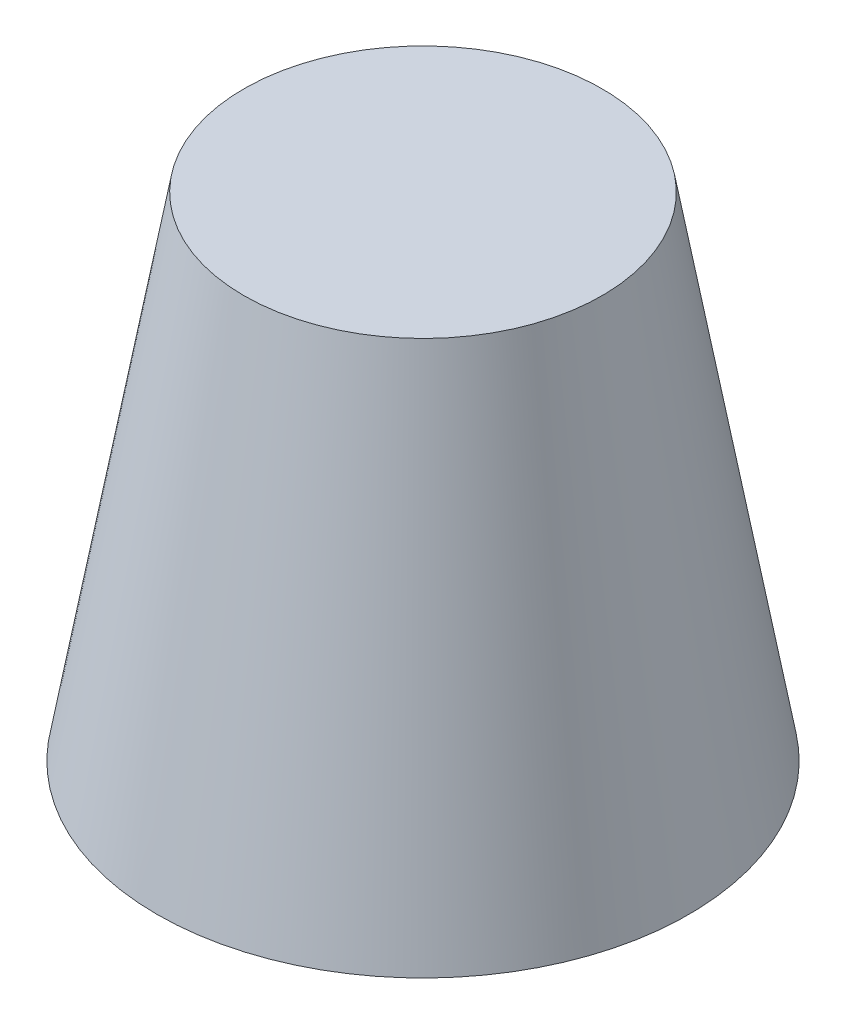
ISO-10303-21;
HEADER;
FILE_DESCRIPTION(('STEP AP214'),'2;1');
FILE_NAME('part.step','',(''),(''),'','','');
FILE_SCHEMA(('AUTOMOTIVE_DESIGN { 1 0 10303 214 1 1 1 1 }'));
ENDSEC;
DATA;
#1=APPLICATION_CONTEXT('core data for automotive mechanical design processes');
#2=APPLICATION_PROTOCOL_DEFINITION('international standard','automotive_design',2000,#1);
#3=PRODUCT_CONTEXT('',#1,'mechanical');
#4=PRODUCT('Part','Part','',(#3));
#5=PRODUCT_RELATED_PRODUCT_CATEGORY('part','',(#4));
#6=PRODUCT_DEFINITION_FORMATION('','',#4);
#7=PRODUCT_DEFINITION_CONTEXT('part definition',#1,'design');
#8=PRODUCT_DEFINITION('design','',#6,#7);
#9=PRODUCT_DEFINITION_SHAPE('','',#8);
#10=(LENGTH_UNIT() NAMED_UNIT(*) SI_UNIT(.MILLI.,.METRE.));
#11=(NAMED_UNIT(*) PLANE_ANGLE_UNIT() SI_UNIT($,.RADIAN.));
#12=(NAMED_UNIT(*) SI_UNIT($,.STERADIAN.) SOLID_ANGLE_UNIT());
#13=UNCERTAINTY_MEASURE_WITH_UNIT(LENGTH_MEASURE(1.E-05),#10,'distance_accuracy_value','');
#14=(GEOMETRIC_REPRESENTATION_CONTEXT(3) GLOBAL_UNCERTAINTY_ASSIGNED_CONTEXT((#13)) GLOBAL_UNIT_ASSIGNED_CONTEXT((#10,
#11,#12)) REPRESENTATION_CONTEXT('',''));
#15=CARTESIAN_POINT('',(0.,0.,0.));
#16=DIRECTION('',(0.,0.,1.));
#17=DIRECTION('',(1.,0.,0.));
#18=AXIS2_PLACEMENT_3D('',#15,#16,#17);
#19=CARTESIAN_POINT('',(0.,0.,0.));
#20=DIRECTION('',(0.,1.,0.));
#21=DIRECTION('',(0.,0.,1.));
#22=AXIS2_PLACEMENT_3D('',#19,#20,#21);
#23=PLANE('',#22);
#24=CARTESIAN_POINT('',(0.,0.,0.));
#25=DIRECTION('',(0.,1.,0.));
#26=DIRECTION('',(0.,0.,1.));
#27=AXIS2_PLACEMENT_3D('',#24,#25,#26);
#28=CIRCLE('',#27,34.4624830724769);
#29=CARTESIAN_POINT('',(0.,0.,34.4624830724769));
#30=VERTEX_POINT('',#29);
#31=EDGE_CURVE('E43',#30,#30,#28,.T.);
#32=ORIENTED_EDGE('',*,*,#31,.T.);
#33=EDGE_LOOP('',(#32));
#34=FACE_BOUND('',#33,.T.);
#35=CARTESIAN_POINT('',(0.,0.,0.));
#36=DIRECTION('',(0.,1.,0.));
#37=DIRECTION('',(0.,0.,1.));
#38=AXIS2_PLACEMENT_3D('',#35,#36,#37);
#39=CIRCLE('',#38,37.0416666666667);
#40=CARTESIAN_POINT('',(0.,0.,37.0416666666667));
#41=VERTEX_POINT('',#40);
#42=EDGE_CURVE('E10',#41,#41,#39,.T.);
#43=ORIENTED_EDGE('',*,*,#42,.F.);
#44=EDGE_LOOP('',(#43));
#45=FACE_BOUND('',#44,.T.);
#46=ADVANCED_FACE('F33',(#34,#45),#23,.F.);
#47=CARTESIAN_POINT('',(0.,0.,0.));
#48=DIRECTION('',(0.,-1.,0.));
#49=DIRECTION('',(0.,0.,-1.));
#50=AXIS2_PLACEMENT_3D('',#47,#48,#49);
#51=CONICAL_SURFACE('',#50,37.0416666666667,0.174532925199437);
#52=CARTESIAN_POINT('',(0.,68.58,0.));
#53=DIRECTION('',(0.,1.,0.));
#54=DIRECTION('',(0.,0.,1.));
#55=AXIS2_PLACEMENT_3D('',#52,#53,#54);
#56=CIRCLE('',#55,24.9491623296798);
#57=CARTESIAN_POINT('',(0.,68.58,24.9491623296798));
#58=VERTEX_POINT('',#57);
#59=EDGE_CURVE('E39',#58,#58,#56,.T.);
#60=ORIENTED_EDGE('',*,*,#59,.F.);
#61=EDGE_LOOP('',(#60));
#62=FACE_BOUND('',#61,.T.);
#63=ORIENTED_EDGE('',*,*,#42,.T.);
#64=EDGE_LOOP('',(#63));
#65=FACE_BOUND('',#64,.T.);
#66=ADVANCED_FACE('F66',(#62,#65),#51,.T.);
#67=CARTESIAN_POINT('',(24.9491623296798,68.58,0.));
#68=DIRECTION('',(0.,-1.,0.));
#69=DIRECTION('',(0.,0.,-1.));
#70=AXIS2_PLACEMENT_3D('',#67,#68,#69);
#71=PLANE('',#70);
#72=ORIENTED_EDGE('',*,*,#59,.T.);
#73=EDGE_LOOP('',(#72));
#74=FACE_BOUND('',#73,.T.);
#75=ADVANCED_FACE('F62',(#74),#71,.F.);
#76=CARTESIAN_POINT('',(0.,-0.441066371274014,0.));
#77=DIRECTION('',(0.,-1.,0.));
#78=DIRECTION('',(0.,0.,-1.));
#79=AXIS2_PLACEMENT_3D('',#76,#77,#78);
#80=CONICAL_SURFACE('',#79,34.5402549740157,0.174532925199437);
#81=CARTESIAN_POINT('',(0.,66.04,0.));
#82=DIRECTION('',(0.,-1.,0.));
#83=DIRECTION('',(0.,0.,-1.));
#84=AXIS2_PLACEMENT_3D('',#81,#82,#83);
#85=CIRCLE('',#84,22.8178492664895);
#86=CARTESIAN_POINT('',(0.,66.04,-22.8178492664895));
#87=VERTEX_POINT('',#86);
#88=EDGE_CURVE('E47',#87,#87,#85,.F.);
#89=ORIENTED_EDGE('',*,*,#88,.T.);
#90=EDGE_LOOP('',(#89));
#91=FACE_BOUND('',#90,.T.);
#92=ORIENTED_EDGE('',*,*,#31,.F.);
#93=EDGE_LOOP('',(#92));
#94=FACE_BOUND('',#93,.T.);
#95=ADVANCED_FACE('F53',(#91,#94),#80,.F.);
#96=CARTESIAN_POINT('',(24.9491623296798,66.04,0.));
#97=DIRECTION('',(0.,-1.,0.));
#98=DIRECTION('',(0.,0.,-1.));
#99=AXIS2_PLACEMENT_3D('',#96,#97,#98);
#100=PLANE('',#99);
#101=ORIENTED_EDGE('',*,*,#88,.F.);
#102=EDGE_LOOP('',(#101));
#103=FACE_BOUND('',#102,.T.);
#104=ADVANCED_FACE('F56',(#103),#100,.T.);
#105=CLOSED_SHELL('',(#46,#66,#75,#95,#104));
#106=MANIFOLD_SOLID_BREP('B2',#105);
#107=ADVANCED_BREP_SHAPE_REPRESENTATION('',(#18,#106),#14);
#108=SHAPE_DEFINITION_REPRESENTATION(#9,#107);
ENDSEC;
END-ISO-10303-21;
